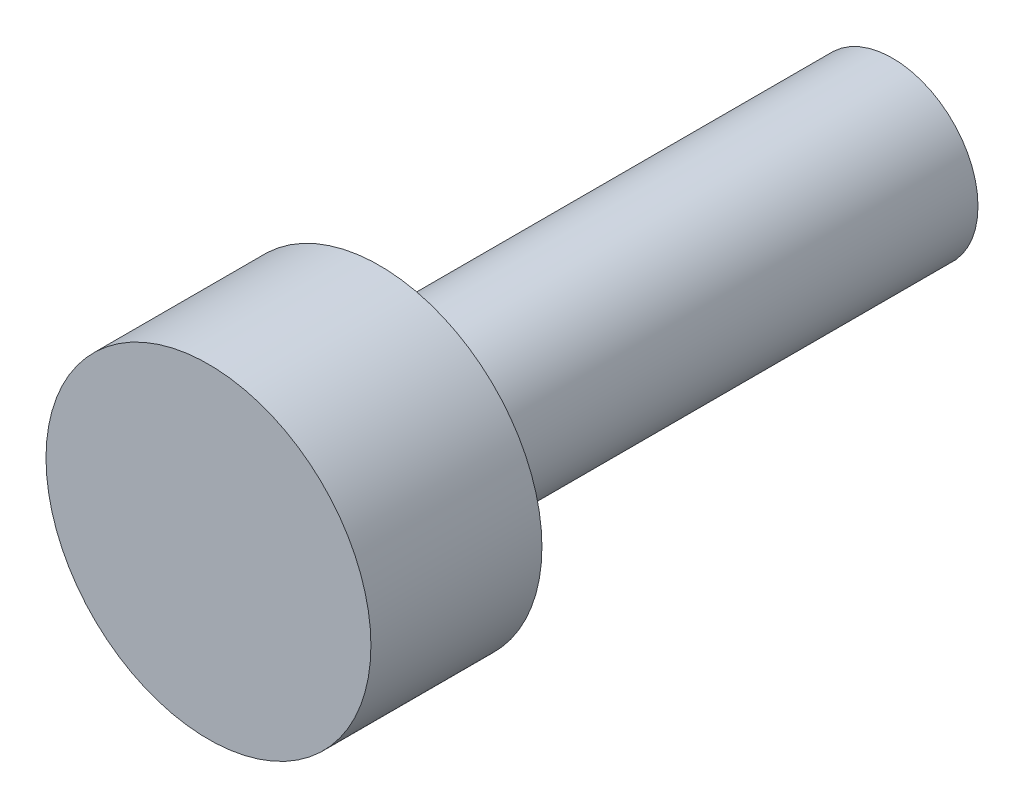
ISO-10303-21;
HEADER;
FILE_DESCRIPTION(('STEP AP214'),'2;1');
FILE_NAME('part.step','',(''),(''),'','','');
FILE_SCHEMA(('AUTOMOTIVE_DESIGN { 1 0 10303 214 1 1 1 1 }'));
ENDSEC;
DATA;
#1=APPLICATION_CONTEXT('core data for automotive mechanical design processes');
#2=APPLICATION_PROTOCOL_DEFINITION('international standard','automotive_design',2000,#1);
#3=PRODUCT_CONTEXT('',#1,'mechanical');
#4=PRODUCT('Part','Part','',(#3));
#5=PRODUCT_RELATED_PRODUCT_CATEGORY('part','',(#4));
#6=PRODUCT_DEFINITION_FORMATION('','',#4);
#7=PRODUCT_DEFINITION_CONTEXT('part definition',#1,'design');
#8=PRODUCT_DEFINITION('design','',#6,#7);
#9=PRODUCT_DEFINITION_SHAPE('','',#8);
#10=(LENGTH_UNIT() NAMED_UNIT(*) SI_UNIT(.MILLI.,.METRE.));
#11=(NAMED_UNIT(*) PLANE_ANGLE_UNIT() SI_UNIT($,.RADIAN.));
#12=(NAMED_UNIT(*) SI_UNIT($,.STERADIAN.) SOLID_ANGLE_UNIT());
#13=UNCERTAINTY_MEASURE_WITH_UNIT(LENGTH_MEASURE(1.E-05),#10,'distance_accuracy_value','');
#14=(GEOMETRIC_REPRESENTATION_CONTEXT(3) GLOBAL_UNCERTAINTY_ASSIGNED_CONTEXT((#13)) GLOBAL_UNIT_ASSIGNED_CONTEXT((#10,
#11,#12)) REPRESENTATION_CONTEXT('',''));
#15=CARTESIAN_POINT('',(0.,0.,0.));
#16=DIRECTION('',(0.,0.,1.));
#17=DIRECTION('',(1.,0.,0.));
#18=AXIS2_PLACEMENT_3D('',#15,#16,#17);
#19=CARTESIAN_POINT('',(0.,0.,0.));
#20=DIRECTION('',(0.,0.,-1.));
#21=DIRECTION('',(-1.,0.,0.));
#22=AXIS2_PLACEMENT_3D('',#19,#20,#21);
#23=CYLINDRICAL_SURFACE('',#22,1.);
#24=CARTESIAN_POINT('',(0.,0.,0.));
#25=DIRECTION('',(0.,0.,1.));
#26=DIRECTION('',(1.,0.,0.));
#27=AXIS2_PLACEMENT_3D('',#24,#25,#26);
#28=CIRCLE('',#27,1.);
#29=CARTESIAN_POINT('',(1.,0.,0.));
#30=VERTEX_POINT('',#29);
#31=EDGE_CURVE('E10',#30,#30,#28,.T.);
#32=ORIENTED_EDGE('',*,*,#31,.F.);
#33=EDGE_LOOP('',(#32));
#34=FACE_BOUND('',#33,.T.);
#35=CARTESIAN_POINT('',(0.,0.,-6.));
#36=DIRECTION('',(0.,0.,1.));
#37=DIRECTION('',(1.,0.,0.));
#38=AXIS2_PLACEMENT_3D('',#35,#36,#37);
#39=CIRCLE('',#38,1.);
#40=CARTESIAN_POINT('',(1.,0.,-6.));
#41=VERTEX_POINT('',#40);
#42=EDGE_CURVE('E37',#41,#41,#39,.T.);
#43=ORIENTED_EDGE('',*,*,#42,.T.);
#44=EDGE_LOOP('',(#43));
#45=FACE_BOUND('',#44,.T.);
#46=ADVANCED_FACE('F40',(#34,#45),#23,.T.);
#47=CARTESIAN_POINT('',(0.,0.,-6.));
#48=DIRECTION('',(0.,0.,1.));
#49=DIRECTION('',(1.,0.,0.));
#50=AXIS2_PLACEMENT_3D('',#47,#48,#49);
#51=PLANE('',#50);
#52=ORIENTED_EDGE('',*,*,#42,.F.);
#53=EDGE_LOOP('',(#52));
#54=FACE_BOUND('',#53,.T.);
#55=ADVANCED_FACE('F58',(#54),#51,.F.);
#56=CARTESIAN_POINT('',(0.,0.,2.));
#57=DIRECTION('',(0.,0.,-1.));
#58=DIRECTION('',(-1.,0.,0.));
#59=AXIS2_PLACEMENT_3D('',#56,#57,#58);
#60=CYLINDRICAL_SURFACE('',#59,1.9);
#61=CARTESIAN_POINT('',(0.,0.,2.));
#62=DIRECTION('',(0.,0.,1.));
#63=DIRECTION('',(1.,0.,0.));
#64=AXIS2_PLACEMENT_3D('',#61,#62,#63);
#65=CIRCLE('',#64,1.9);
#66=CARTESIAN_POINT('',(1.9,0.,2.));
#67=VERTEX_POINT('',#66);
#68=EDGE_CURVE('E50',#67,#67,#65,.T.);
#69=ORIENTED_EDGE('',*,*,#68,.F.);
#70=EDGE_LOOP('',(#69));
#71=FACE_BOUND('',#70,.T.);
#72=CARTESIAN_POINT('',(0.,0.,0.));
#73=DIRECTION('',(0.,0.,1.));
#74=DIRECTION('',(1.,0.,0.));
#75=AXIS2_PLACEMENT_3D('',#72,#73,#74);
#76=CIRCLE('',#75,1.9);
#77=CARTESIAN_POINT('',(1.9,0.,0.));
#78=VERTEX_POINT('',#77);
#79=EDGE_CURVE('E47',#78,#78,#76,.T.);
#80=ORIENTED_EDGE('',*,*,#79,.T.);
#81=EDGE_LOOP('',(#80));
#82=FACE_BOUND('',#81,.T.);
#83=ADVANCED_FACE('F60',(#71,#82),#60,.T.);
#84=CARTESIAN_POINT('',(0.,0.,2.));
#85=DIRECTION('',(0.,0.,1.));
#86=DIRECTION('',(1.,0.,0.));
#87=AXIS2_PLACEMENT_3D('',#84,#85,#86);
#88=PLANE('',#87);
#89=ORIENTED_EDGE('',*,*,#68,.T.);
#90=EDGE_LOOP('',(#89));
#91=FACE_BOUND('',#90,.T.);
#92=ADVANCED_FACE('F54',(#91),#88,.T.);
#93=CARTESIAN_POINT('',(0.,0.,0.));
#94=DIRECTION('',(0.,0.,1.));
#95=DIRECTION('',(1.,0.,0.));
#96=AXIS2_PLACEMENT_3D('',#93,#94,#95);
#97=PLANE('',#96);
#98=ORIENTED_EDGE('',*,*,#31,.T.);
#99=EDGE_LOOP('',(#98));
#100=FACE_BOUND('',#99,.T.);
#101=ORIENTED_EDGE('',*,*,#79,.F.);
#102=EDGE_LOOP('',(#101));
#103=FACE_BOUND('',#102,.T.);
#104=ADVANCED_FACE('F63',(#100,#103),#97,.F.);
#105=CLOSED_SHELL('',(#46,#55,#83,#92,#104));
#106=MANIFOLD_SOLID_BREP('B2',#105);
#107=ADVANCED_BREP_SHAPE_REPRESENTATION('',(#18,#106),#14);
#108=SHAPE_DEFINITION_REPRESENTATION(#9,#107);
ENDSEC;
END-ISO-10303-21;
